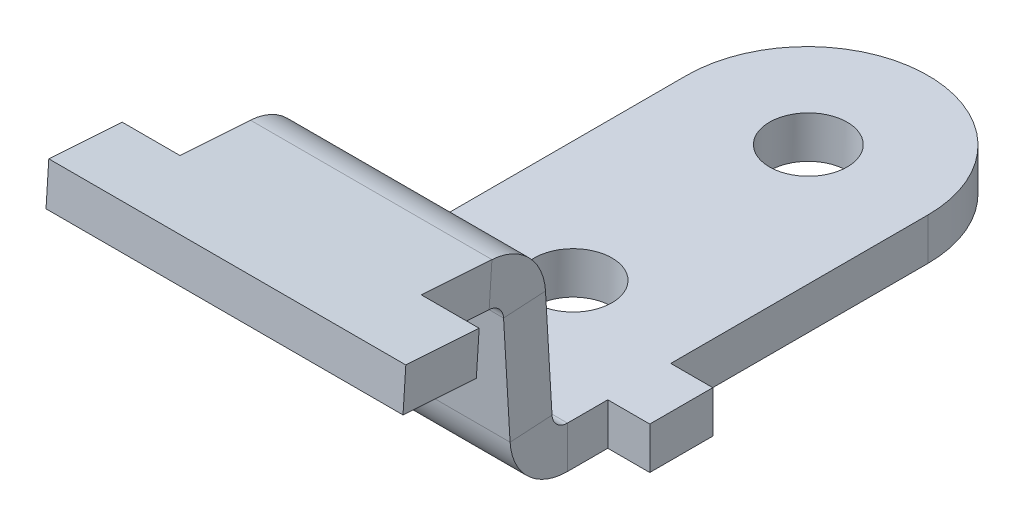
ISO-10303-21;
HEADER;
FILE_DESCRIPTION(('STEP AP214'),'2;1');
FILE_NAME('part.step','',(''),(''),'','','');
FILE_SCHEMA(('AUTOMOTIVE_DESIGN { 1 0 10303 214 1 1 1 1 }'));
ENDSEC;
DATA;
#1=APPLICATION_CONTEXT('core data for automotive mechanical design processes');
#2=APPLICATION_PROTOCOL_DEFINITION('international standard','automotive_design',2000,#1);
#3=PRODUCT_CONTEXT('',#1,'mechanical');
#4=PRODUCT('Part','Part','',(#3));
#5=PRODUCT_RELATED_PRODUCT_CATEGORY('part','',(#4));
#6=PRODUCT_DEFINITION_FORMATION('','',#4);
#7=PRODUCT_DEFINITION_CONTEXT('part definition',#1,'design');
#8=PRODUCT_DEFINITION('design','',#6,#7);
#9=PRODUCT_DEFINITION_SHAPE('','',#8);
#10=(LENGTH_UNIT() NAMED_UNIT(*) SI_UNIT(.MILLI.,.METRE.));
#11=(NAMED_UNIT(*) PLANE_ANGLE_UNIT() SI_UNIT($,.RADIAN.));
#12=(NAMED_UNIT(*) SI_UNIT($,.STERADIAN.) SOLID_ANGLE_UNIT());
#13=UNCERTAINTY_MEASURE_WITH_UNIT(LENGTH_MEASURE(1.E-05),#10,'distance_accuracy_value','');
#14=(GEOMETRIC_REPRESENTATION_CONTEXT(3) GLOBAL_UNCERTAINTY_ASSIGNED_CONTEXT((#13)) GLOBAL_UNIT_ASSIGNED_CONTEXT((#10,
#11,#12)) REPRESENTATION_CONTEXT('',''));
#15=CARTESIAN_POINT('',(0.,0.,0.));
#16=DIRECTION('',(0.,0.,1.));
#17=DIRECTION('',(1.,0.,0.));
#18=AXIS2_PLACEMENT_3D('',#15,#16,#17);
#19=CARTESIAN_POINT('',(5.75,7.8082437090074,26.6971817474205));
#20=DIRECTION('',(-1.,0.,0.));
#21=DIRECTION('',(0.,0.,1.));
#22=AXIS2_PLACEMENT_3D('',#19,#20,#21);
#23=PLANE('',#22);
#24=DIRECTION('',(0.,0.,1.));
#25=VECTOR('',#24,1.);
#26=CARTESIAN_POINT('',(5.75,0.,0.));
#27=LINE('',#26,#25);
#28=CARTESIAN_POINT('',(5.75,0.,5.75));
#29=VERTEX_POINT('',#28);
#30=CARTESIAN_POINT('',(5.75,0.,18.));
#31=VERTEX_POINT('',#30);
#32=EDGE_CURVE('E370',#29,#31,#27,.T.);
#33=ORIENTED_EDGE('',*,*,#32,.F.);
#34=DIRECTION('',(0.,-1.,0.));
#35=VECTOR('',#34,1.);
#36=CARTESIAN_POINT('',(5.75,2.,5.75));
#37=LINE('',#36,#35);
#38=CARTESIAN_POINT('',(5.75,2.,5.75));
#39=VERTEX_POINT('',#38);
#40=EDGE_CURVE('E44',#29,#39,#37,.F.);
#41=ORIENTED_EDGE('',*,*,#40,.T.);
#42=DIRECTION('',(0.,0.,1.));
#43=VECTOR('',#42,1.);
#44=CARTESIAN_POINT('',(5.75,2.,0.));
#45=LINE('',#44,#43);
#46=CARTESIAN_POINT('',(5.75,2.,18.));
#47=VERTEX_POINT('',#46);
#48=EDGE_CURVE('E373',#39,#47,#45,.T.);
#49=ORIENTED_EDGE('',*,*,#48,.T.);
#50=DIRECTION('',(0.,1.,0.));
#51=VECTOR('',#50,1.);
#52=CARTESIAN_POINT('',(5.75,0.,18.));
#53=LINE('',#52,#51);
#54=EDGE_CURVE('E345',#31,#47,#53,.T.);
#55=ORIENTED_EDGE('',*,*,#54,.F.);
#56=EDGE_LOOP('',(#33,#41,#49,#55));
#57=FACE_BOUND('',#56,.T.);
#58=ADVANCED_FACE('F36',(#57),#23,.F.);
#59=CARTESIAN_POINT('',(5.75,2.5759013147276,25.6515236067487));
#60=DIRECTION('',(1.,0.,0.));
#61=DIRECTION('',(0.,0.,-1.));
#62=AXIS2_PLACEMENT_3D('',#59,#60,#61);
#63=PLANE('',#62);
#64=DIRECTION('',(0.,0.0587220219514705,-0.998274373174996));
#65=VECTOR('',#64,1.);
#66=CARTESIAN_POINT('',(5.75,2.5759013147276,25.6515236067487));
#67=LINE('',#66,#65);
#68=CARTESIAN_POINT('',(5.75,2.5759013147276,25.6515236067487));
#69=VERTEX_POINT('',#68);
#70=CARTESIAN_POINT('',(5.75,2.69334535863054,23.6549748603987));
#71=VERTEX_POINT('',#70);
#72=EDGE_CURVE('E407',#69,#71,#67,.T.);
#73=ORIENTED_EDGE('',*,*,#72,.F.);
#74=CARTESIAN_POINT('',(5.75,2.7366,22.919645957118));
#75=DIRECTION('',(1.,0.,0.));
#76=DIRECTION('',(0.,0.,-1.));
#77=AXIS2_PLACEMENT_3D('',#74,#75,#76);
#78=CIRCLE('',#77,2.7366);
#79=CARTESIAN_POINT('',(5.75,0.,22.919645957118));
#80=VERTEX_POINT('',#79);
#81=EDGE_CURVE('E366',#80,#69,#78,.F.);
#82=ORIENTED_EDGE('',*,*,#81,.F.);
#83=DIRECTION('',(0.,-1.,0.));
#84=VECTOR('',#83,1.);
#85=CARTESIAN_POINT('',(5.75,2.,22.919645957118));
#86=LINE('',#85,#84);
#87=CARTESIAN_POINT('',(5.75,2.,22.919645957118));
#88=VERTEX_POINT('',#87);
#89=EDGE_CURVE('E404',#88,#80,#86,.T.);
#90=ORIENTED_EDGE('',*,*,#89,.F.);
#91=CARTESIAN_POINT('',(5.75,2.7366,22.919645957118));
#92=DIRECTION('',(1.,0.,0.));
#93=DIRECTION('',(0.,0.,-1.));
#94=AXIS2_PLACEMENT_3D('',#91,#92,#93);
#95=CIRCLE('',#94,0.7366);
#96=EDGE_CURVE('E375',#88,#71,#95,.F.);
#97=ORIENTED_EDGE('',*,*,#96,.T.);
#98=EDGE_LOOP('',(#73,#82,#90,#97));
#99=FACE_BOUND('',#98,.T.);
#100=ADVANCED_FACE('F420',(#99),#63,.T.);
#101=CARTESIAN_POINT('',(5.75,2.,22.919645957118));
#102=DIRECTION('',(1.,0.,0.));
#103=DIRECTION('',(0.,0.,-1.));
#104=AXIS2_PLACEMENT_3D('',#101,#102,#103);
#105=PLANE('',#104);
#106=DIRECTION('',(0.,0.998274373174996,0.0587220219514708));
#107=VECTOR('',#106,1.);
#108=CARTESIAN_POINT('',(5.75,0.,25.5));
#109=LINE('',#108,#107);
#110=CARTESIAN_POINT('',(5.75,7.85149835037685,25.9618528441398));
#111=VERTEX_POINT('',#110);
#112=EDGE_CURVE('E363',#69,#111,#109,.T.);
#113=ORIENTED_EDGE('',*,*,#112,.F.);
#114=ORIENTED_EDGE('',*,*,#72,.T.);
#115=DIRECTION('',(0.,0.998274373174996,0.0587220219514708));
#116=VECTOR('',#115,1.);
#117=CARTESIAN_POINT('',(5.75,0.117444043902938,23.50345125365));
#118=LINE('',#117,#116);
#119=CARTESIAN_POINT('',(5.75,7.96894239427979,23.9653040977898));
#120=VERTEX_POINT('',#119);
#121=EDGE_CURVE('E378',#71,#120,#118,.T.);
#122=ORIENTED_EDGE('',*,*,#121,.T.);
#123=DIRECTION('',(0.,-0.058722021951469,0.998274373174996));
#124=VECTOR('',#123,1.);
#125=CARTESIAN_POINT('',(5.75,7.96894239427979,23.9653040977898));
#126=LINE('',#125,#124);
#127=EDGE_CURVE('E400',#120,#111,#126,.T.);
#128=ORIENTED_EDGE('',*,*,#127,.T.);
#129=EDGE_LOOP('',(#113,#114,#122,#128));
#130=FACE_BOUND('',#129,.T.);
#131=ADVANCED_FACE('F411',(#130),#105,.T.);
#132=CARTESIAN_POINT('',(5.75,8.54321225628458,26.6481838442687));
#133=DIRECTION('',(1.,0.,0.));
#134=DIRECTION('',(0.,0.,-1.));
#135=AXIS2_PLACEMENT_3D('',#132,#133,#134);
#136=PLANE('',#135);
#137=DIRECTION('',(0.,0.997785157856609,-0.0665190105237738));
#138=VECTOR('',#137,1.);
#139=CARTESIAN_POINT('',(5.75,8.54321225628458,26.6481838442687));
#140=LINE('',#139,#138);
#141=CARTESIAN_POINT('',(5.75,8.54321225628458,26.6481838442687));
#142=VERTEX_POINT('',#141);
#143=CARTESIAN_POINT('',(5.75,10.5387825719978,26.5151458232212));
#144=VERTEX_POINT('',#143);
#145=EDGE_CURVE('E402',#142,#144,#140,.T.);
#146=ORIENTED_EDGE('',*,*,#145,.F.);
#147=CARTESIAN_POINT('',(5.75,7.8082437090074,26.6971817474205));
#148=DIRECTION('',(-1.,0.,0.));
#149=DIRECTION('',(0.,0.,1.));
#150=AXIS2_PLACEMENT_3D('',#147,#148,#149);
#151=CIRCLE('',#150,0.7366);
#152=EDGE_CURVE('E360',#111,#142,#151,.F.);
#153=ORIENTED_EDGE('',*,*,#152,.F.);
#154=ORIENTED_EDGE('',*,*,#127,.F.);
#155=CARTESIAN_POINT('',(5.75,7.8082437090074,26.6971817474205));
#156=DIRECTION('',(1.,0.,0.));
#157=DIRECTION('',(0.,0.,-1.));
#158=AXIS2_PLACEMENT_3D('',#155,#156,#157);
#159=CIRCLE('',#158,2.7366);
#160=EDGE_CURVE('E381',#120,#144,#159,.T.);
#161=ORIENTED_EDGE('',*,*,#160,.T.);
#162=EDGE_LOOP('',(#146,#153,#154,#161));
#163=FACE_BOUND('',#162,.T.);
#164=ADVANCED_FACE('F436',(#163),#136,.T.);
#165=CARTESIAN_POINT('',(5.75,7.96894239427979,23.9653040977898));
#166=DIRECTION('',(1.,0.,0.));
#167=DIRECTION('',(0.,0.,-1.));
#168=AXIS2_PLACEMENT_3D('',#165,#166,#167);
#169=PLANE('',#168);
#170=DIRECTION('',(0.,0.997785157856609,-0.0665190105237738));
#171=VECTOR('',#170,1.);
#172=CARTESIAN_POINT('',(5.75,8.76718346316679,30.0077519475019));
#173=LINE('',#172,#171);
#174=CARTESIAN_POINT('',(5.75,8.76718346316679,30.0077519475019));
#175=VERTEX_POINT('',#174);
#176=CARTESIAN_POINT('',(5.75,10.76275377888,29.8747139264543));
#177=VERTEX_POINT('',#176);
#178=EDGE_CURVE('E321',#175,#177,#173,.T.);
#179=ORIENTED_EDGE('',*,*,#178,.F.);
#180=DIRECTION('',(0.,0.0665190105237738,0.997785157856609));
#181=VECTOR('',#180,1.);
#182=CARTESIAN_POINT('',(5.75,8.5,26.));
#183=LINE('',#182,#181);
#184=EDGE_CURVE('E357',#142,#175,#183,.T.);
#185=ORIENTED_EDGE('',*,*,#184,.F.);
#186=ORIENTED_EDGE('',*,*,#145,.T.);
#187=DIRECTION('',(0.,0.0665190105237738,0.997785157856609));
#188=VECTOR('',#187,1.);
#189=CARTESIAN_POINT('',(5.75,10.4955703157132,25.8669619789525));
#190=LINE('',#189,#188);
#191=EDGE_CURVE('E348',#144,#177,#190,.T.);
#192=ORIENTED_EDGE('',*,*,#191,.T.);
#193=EDGE_LOOP('',(#179,#185,#186,#192));
#194=FACE_BOUND('',#193,.T.);
#195=ADVANCED_FACE('F540',(#194),#169,.T.);
#196=CARTESIAN_POINT('',(5.75,10.4955703157132,25.8669619789525));
#197=DIRECTION('',(0.,-0.997785157856609,0.0665190105237738));
#198=DIRECTION('',(0.,-0.0665190105237738,-0.997785157856609));
#199=AXIS2_PLACEMENT_3D('',#196,#197,#198);
#200=PLANE('',#199);
#201=DIRECTION('',(-1.,0.,0.));
#202=VECTOR('',#201,1.);
#203=CARTESIAN_POINT('',(5.75,10.5387825719978,26.5151458232212));
#204=LINE('',#203,#202);
#205=CARTESIAN_POINT('',(-5.75,10.5387825719978,26.5151458232212));
#206=VERTEX_POINT('',#205);
#207=EDGE_CURVE('E384',#144,#206,#204,.T.);
#208=ORIENTED_EDGE('',*,*,#207,.T.);
#209=DIRECTION('',(0.,0.0665190105237738,0.997785157856609));
#210=VECTOR('',#209,1.);
#211=CARTESIAN_POINT('',(-5.75,10.4955703157132,25.8669619789525));
#212=LINE('',#211,#210);
#213=CARTESIAN_POINT('',(-5.75,10.76275377888,29.8747139264543));
#214=VERTEX_POINT('',#213);
#215=EDGE_CURVE('E247',#206,#214,#212,.T.);
#216=ORIENTED_EDGE('',*,*,#215,.T.);
#217=DIRECTION('',(1.,0.,0.));
#218=VECTOR('',#217,1.);
#219=CARTESIAN_POINT('',(-5.75,10.76275377888,29.8747139264543));
#220=LINE('',#219,#218);
#221=CARTESIAN_POINT('',(-8.5,10.76275377888,29.8747139264543));
#222=VERTEX_POINT('',#221);
#223=EDGE_CURVE('E218',#222,#214,#220,.T.);
#224=ORIENTED_EDGE('',*,*,#223,.F.);
#225=DIRECTION('',(0.,-0.0665190105237738,-0.997785157856609));
#226=VECTOR('',#225,1.);
#227=CARTESIAN_POINT('',(-8.5,10.9955703157132,33.3669619789525));
#228=LINE('',#227,#226);
#229=CARTESIAN_POINT('',(-8.5,10.9955703157132,33.3669619789525));
#230=VERTEX_POINT('',#229);
#231=EDGE_CURVE('E773',#230,#222,#228,.T.);
#232=ORIENTED_EDGE('',*,*,#231,.F.);
#233=DIRECTION('',(-1.,0.,0.));
#234=VECTOR('',#233,1.);
#235=CARTESIAN_POINT('',(5.75,10.9955703157132,33.3669619789525));
#236=LINE('',#235,#234);
#237=CARTESIAN_POINT('',(8.5,10.9955703157132,33.3669619789525));
#238=VERTEX_POINT('',#237);
#239=EDGE_CURVE('E206',#238,#230,#236,.T.);
#240=ORIENTED_EDGE('',*,*,#239,.F.);
#241=DIRECTION('',(0.,-0.0665190105237738,-0.997785157856609));
#242=VECTOR('',#241,1.);
#243=CARTESIAN_POINT('',(8.5,10.9955703157132,33.3669619789525));
#244=LINE('',#243,#242);
#245=CARTESIAN_POINT('',(8.5,10.76275377888,29.8747139264543));
#246=VERTEX_POINT('',#245);
#247=EDGE_CURVE('E311',#238,#246,#244,.T.);
#248=ORIENTED_EDGE('',*,*,#247,.T.);
#249=DIRECTION('',(-1.,0.,0.));
#250=VECTOR('',#249,1.);
#251=CARTESIAN_POINT('',(5.75,10.76275377888,29.8747139264543));
#252=LINE('',#251,#250);
#253=EDGE_CURVE('E314',#246,#177,#252,.T.);
#254=ORIENTED_EDGE('',*,*,#253,.T.);
#255=ORIENTED_EDGE('',*,*,#191,.F.);
#256=EDGE_LOOP('',(#208,#216,#224,#232,#240,#248,#254,#255));
#257=FACE_BOUND('',#256,.T.);
#258=ADVANCED_FACE('F537',(#257),#200,.F.);
#259=CARTESIAN_POINT('',(5.75,9.,33.5));
#260=DIRECTION('',(0.,0.0665190105237738,0.997785157856609));
#261=DIRECTION('',(0.,-0.997785157856609,0.0665190105237738));
#262=AXIS2_PLACEMENT_3D('',#259,#260,#261);
#263=PLANE('',#262);
#264=ORIENTED_EDGE('',*,*,#239,.T.);
#265=DIRECTION('',(0.,0.997785157856609,-0.0665190105237738));
#266=VECTOR('',#265,1.);
#267=CARTESIAN_POINT('',(-8.5,9.,33.5));
#268=LINE('',#267,#266);
#269=CARTESIAN_POINT('',(-8.5,9.,33.5));
#270=VERTEX_POINT('',#269);
#271=EDGE_CURVE('E213',#270,#230,#268,.T.);
#272=ORIENTED_EDGE('',*,*,#271,.F.);
#273=DIRECTION('',(-1.,0.,0.));
#274=VECTOR('',#273,1.);
#275=CARTESIAN_POINT('',(5.75,9.,33.5));
#276=LINE('',#275,#274);
#277=CARTESIAN_POINT('',(8.5,9.,33.5));
#278=VERTEX_POINT('',#277);
#279=EDGE_CURVE('E195',#278,#270,#276,.T.);
#280=ORIENTED_EDGE('',*,*,#279,.F.);
#281=DIRECTION('',(0.,0.997785157856609,-0.0665190105237738));
#282=VECTOR('',#281,1.);
#283=CARTESIAN_POINT('',(8.5,9.,33.5));
#284=LINE('',#283,#282);
#285=EDGE_CURVE('E316',#278,#238,#284,.T.);
#286=ORIENTED_EDGE('',*,*,#285,.T.);
#287=EDGE_LOOP('',(#264,#272,#280,#286));
#288=FACE_BOUND('',#287,.T.);
#289=ADVANCED_FACE('F220',(#288),#263,.T.);
#290=CARTESIAN_POINT('',(5.75,8.5,26.));
#291=DIRECTION('',(0.,-0.997785157856609,0.0665190105237738));
#292=DIRECTION('',(0.,-0.0665190105237738,-0.997785157856609));
#293=AXIS2_PLACEMENT_3D('',#290,#291,#292);
#294=PLANE('',#293);
#295=ORIENTED_EDGE('',*,*,#279,.T.);
#296=DIRECTION('',(0.,-0.0665190105237738,-0.997785157856609));
#297=VECTOR('',#296,1.);
#298=CARTESIAN_POINT('',(-8.5,9.,33.5));
#299=LINE('',#298,#297);
#300=CARTESIAN_POINT('',(-8.5,8.76718346316679,30.0077519475019));
#301=VERTEX_POINT('',#300);
#302=EDGE_CURVE('E198',#270,#301,#299,.T.);
#303=ORIENTED_EDGE('',*,*,#302,.T.);
#304=DIRECTION('',(1.,0.,0.));
#305=VECTOR('',#304,1.);
#306=CARTESIAN_POINT('',(-5.75,8.76718346316679,30.0077519475019));
#307=LINE('',#306,#305);
#308=CARTESIAN_POINT('',(-5.75,8.76718346316679,30.0077519475019));
#309=VERTEX_POINT('',#308);
#310=EDGE_CURVE('E217',#301,#309,#307,.T.);
#311=ORIENTED_EDGE('',*,*,#310,.T.);
#312=DIRECTION('',(0.,0.0665190105237738,0.997785157856609));
#313=VECTOR('',#312,1.);
#314=CARTESIAN_POINT('',(-5.75,8.5,26.));
#315=LINE('',#314,#313);
#316=CARTESIAN_POINT('',(-5.75,8.54321225628458,26.6481838442687));
#317=VERTEX_POINT('',#316);
#318=EDGE_CURVE('E255',#317,#309,#315,.T.);
#319=ORIENTED_EDGE('',*,*,#318,.F.);
#320=DIRECTION('',(-1.,0.,0.));
#321=VECTOR('',#320,1.);
#322=CARTESIAN_POINT('',(5.75,8.54321225628458,26.6481838442687));
#323=LINE('',#322,#321);
#324=EDGE_CURVE('E207',#142,#317,#323,.T.);
#325=ORIENTED_EDGE('',*,*,#324,.F.);
#326=ORIENTED_EDGE('',*,*,#184,.T.);
#327=DIRECTION('',(-1.,0.,0.));
#328=VECTOR('',#327,1.);
#329=CARTESIAN_POINT('',(5.75,8.76718346316679,30.0077519475019));
#330=LINE('',#329,#328);
#331=CARTESIAN_POINT('',(8.5,8.76718346316679,30.0077519475019));
#332=VERTEX_POINT('',#331);
#333=EDGE_CURVE('E313',#332,#175,#330,.T.);
#334=ORIENTED_EDGE('',*,*,#333,.F.);
#335=DIRECTION('',(0.,-0.0665190105237738,-0.997785157856609));
#336=VECTOR('',#335,1.);
#337=CARTESIAN_POINT('',(8.5,9.,33.5));
#338=LINE('',#337,#336);
#339=EDGE_CURVE('E201',#278,#332,#338,.T.);
#340=ORIENTED_EDGE('',*,*,#339,.F.);
#341=EDGE_LOOP('',(#295,#303,#311,#319,#325,#326,#334,#340));
#342=FACE_BOUND('',#341,.T.);
#343=ADVANCED_FACE('F197',(#342),#294,.T.);
#344=CARTESIAN_POINT('',(5.75,7.8082437090074,26.6971817474205));
#345=DIRECTION('',(-1.,0.,0.));
#346=DIRECTION('',(0.,0.,1.));
#347=AXIS2_PLACEMENT_3D('',#344,#345,#346);
#348=CYLINDRICAL_SURFACE('',#347,0.7366);
#349=ORIENTED_EDGE('',*,*,#324,.T.);
#350=CARTESIAN_POINT('',(-5.75,7.8082437090074,26.6971817474205));
#351=DIRECTION('',(-1.,0.,0.));
#352=DIRECTION('',(0.,0.,1.));
#353=AXIS2_PLACEMENT_3D('',#350,#351,#352);
#354=CIRCLE('',#353,0.7366);
#355=CARTESIAN_POINT('',(-5.75,7.85149835037685,25.9618528441398));
#356=VERTEX_POINT('',#355);
#357=EDGE_CURVE('E258',#356,#317,#354,.F.);
#358=ORIENTED_EDGE('',*,*,#357,.F.);
#359=DIRECTION('',(-1.,0.,0.));
#360=VECTOR('',#359,1.);
#361=CARTESIAN_POINT('',(5.75,7.85149835037685,25.9618528441398));
#362=LINE('',#361,#360);
#363=EDGE_CURVE('E396',#111,#356,#362,.T.);
#364=ORIENTED_EDGE('',*,*,#363,.F.);
#365=ORIENTED_EDGE('',*,*,#152,.T.);
#366=EDGE_LOOP('',(#349,#358,#364,#365));
#367=FACE_BOUND('',#366,.T.);
#368=ADVANCED_FACE('F442',(#367),#348,.F.);
#369=CARTESIAN_POINT('',(5.75,0.,25.5));
#370=DIRECTION('',(0.,-0.0587220219514708,0.998274373174996));
#371=DIRECTION('',(0.,-0.998274373174996,-0.0587220219514708));
#372=AXIS2_PLACEMENT_3D('',#369,#370,#371);
#373=PLANE('',#372);
#374=ORIENTED_EDGE('',*,*,#363,.T.);
#375=DIRECTION('',(0.,0.998274373174996,0.0587220219514708));
#376=VECTOR('',#375,1.);
#377=CARTESIAN_POINT('',(-5.75,0.,25.5));
#378=LINE('',#377,#376);
#379=CARTESIAN_POINT('',(-5.75,2.5759013147276,25.6515236067487));
#380=VERTEX_POINT('',#379);
#381=EDGE_CURVE('E261',#380,#356,#378,.T.);
#382=ORIENTED_EDGE('',*,*,#381,.F.);
#383=DIRECTION('',(-1.,0.,0.));
#384=VECTOR('',#383,1.);
#385=CARTESIAN_POINT('',(5.75,2.5759013147276,25.6515236067487));
#386=LINE('',#385,#384);
#387=EDGE_CURVE('E394',#69,#380,#386,.T.);
#388=ORIENTED_EDGE('',*,*,#387,.F.);
#389=ORIENTED_EDGE('',*,*,#112,.T.);
#390=EDGE_LOOP('',(#374,#382,#388,#389));
#391=FACE_BOUND('',#390,.T.);
#392=ADVANCED_FACE('F445',(#391),#373,.T.);
#393=CARTESIAN_POINT('',(5.75,2.7366,22.919645957118));
#394=DIRECTION('',(-1.,0.,0.));
#395=DIRECTION('',(0.,0.,1.));
#396=AXIS2_PLACEMENT_3D('',#393,#394,#395);
#397=CYLINDRICAL_SURFACE('',#396,2.7366);
#398=ORIENTED_EDGE('',*,*,#387,.T.);
#399=CARTESIAN_POINT('',(-5.75,2.7366,22.919645957118));
#400=DIRECTION('',(1.,0.,0.));
#401=DIRECTION('',(0.,0.,-1.));
#402=AXIS2_PLACEMENT_3D('',#399,#400,#401);
#403=CIRCLE('',#402,2.7366);
#404=CARTESIAN_POINT('',(-5.75,0.,22.919645957118));
#405=VERTEX_POINT('',#404);
#406=EDGE_CURVE('E264',#405,#380,#403,.F.);
#407=ORIENTED_EDGE('',*,*,#406,.F.);
#408=DIRECTION('',(-1.,0.,0.));
#409=VECTOR('',#408,1.);
#410=CARTESIAN_POINT('',(5.75,0.,22.919645957118));
#411=LINE('',#410,#409);
#412=EDGE_CURVE('E392',#80,#405,#411,.T.);
#413=ORIENTED_EDGE('',*,*,#412,.F.);
#414=ORIENTED_EDGE('',*,*,#81,.T.);
#415=EDGE_LOOP('',(#398,#407,#413,#414));
#416=FACE_BOUND('',#415,.T.);
#417=ADVANCED_FACE('F448',(#416),#397,.T.);
#418=CARTESIAN_POINT('',(5.75,0.,0.));
#419=DIRECTION('',(0.,-1.,0.));
#420=DIRECTION('',(0.,0.,-1.));
#421=AXIS2_PLACEMENT_3D('',#418,#419,#420);
#422=PLANE('',#421);
#423=ORIENTED_EDGE('',*,*,#412,.T.);
#424=DIRECTION('',(0.,0.,1.));
#425=VECTOR('',#424,1.);
#426=CARTESIAN_POINT('',(-5.75,0.,0.));
#427=LINE('',#426,#425);
#428=CARTESIAN_POINT('',(-5.75,0.,21.));
#429=VERTEX_POINT('',#428);
#430=EDGE_CURVE('E267',#429,#405,#427,.T.);
#431=ORIENTED_EDGE('',*,*,#430,.F.);
#432=DIRECTION('',(-1.,0.,0.));
#433=VECTOR('',#432,1.);
#434=CARTESIAN_POINT('',(-5.75,0.,21.));
#435=LINE('',#434,#433);
#436=CARTESIAN_POINT('',(-7.75,0.,21.));
#437=VERTEX_POINT('',#436);
#438=EDGE_CURVE('E227',#429,#437,#435,.T.);
#439=ORIENTED_EDGE('',*,*,#438,.T.);
#440=DIRECTION('',(0.,0.,-1.));
#441=VECTOR('',#440,1.);
#442=CARTESIAN_POINT('',(-7.75,0.,18.));
#443=LINE('',#442,#441);
#444=CARTESIAN_POINT('',(-7.75,0.,18.));
#445=VERTEX_POINT('',#444);
#446=EDGE_CURVE('E230',#437,#445,#443,.T.);
#447=ORIENTED_EDGE('',*,*,#446,.T.);
#448=DIRECTION('',(1.,0.,0.));
#449=VECTOR('',#448,1.);
#450=CARTESIAN_POINT('',(-5.75,0.,18.));
#451=LINE('',#450,#449);
#452=CARTESIAN_POINT('',(-5.75,0.,18.));
#453=VERTEX_POINT('',#452);
#454=EDGE_CURVE('E234',#445,#453,#451,.T.);
#455=ORIENTED_EDGE('',*,*,#454,.T.);
#456=CARTESIAN_POINT('',(-5.75,0.,5.75));
#457=VERTEX_POINT('',#456);
#458=EDGE_CURVE('E268',#457,#453,#427,.T.);
#459=ORIENTED_EDGE('',*,*,#458,.F.);
#460=CARTESIAN_POINT('',(0.,0.,5.75));
#461=DIRECTION('',(0.,-1.,0.));
#462=DIRECTION('',(0.,0.,-1.));
#463=AXIS2_PLACEMENT_3D('',#460,#461,#462);
#464=CIRCLE('',#463,5.75);
#465=EDGE_CURVE('E58',#457,#29,#464,.T.);
#466=ORIENTED_EDGE('',*,*,#465,.T.);
#467=ORIENTED_EDGE('',*,*,#32,.T.);
#468=DIRECTION('',(-1.,0.,0.));
#469=VECTOR('',#468,1.);
#470=CARTESIAN_POINT('',(5.75,0.,18.));
#471=LINE('',#470,#469);
#472=CARTESIAN_POINT('',(7.75,0.,18.));
#473=VERTEX_POINT('',#472);
#474=EDGE_CURVE('E334',#473,#31,#471,.T.);
#475=ORIENTED_EDGE('',*,*,#474,.F.);
#476=DIRECTION('',(0.,0.,-1.));
#477=VECTOR('',#476,1.);
#478=CARTESIAN_POINT('',(7.75,0.,18.));
#479=LINE('',#478,#477);
#480=CARTESIAN_POINT('',(7.75,0.,21.));
#481=VERTEX_POINT('',#480);
#482=EDGE_CURVE('E330',#481,#473,#479,.T.);
#483=ORIENTED_EDGE('',*,*,#482,.F.);
#484=DIRECTION('',(1.,0.,0.));
#485=VECTOR('',#484,1.);
#486=CARTESIAN_POINT('',(5.75,0.,21.));
#487=LINE('',#486,#485);
#488=CARTESIAN_POINT('',(5.75,0.,21.));
#489=VERTEX_POINT('',#488);
#490=EDGE_CURVE('E327',#489,#481,#487,.T.);
#491=ORIENTED_EDGE('',*,*,#490,.F.);
#492=EDGE_CURVE('E369',#489,#80,#27,.T.);
#493=ORIENTED_EDGE('',*,*,#492,.T.);
#494=EDGE_LOOP('',(#423,#431,#439,#447,#455,#459,#466,#467,#475,#483,#491,#493));
#495=FACE_BOUND('',#494,.T.);
#496=CARTESIAN_POINT('',(0.,0.,16.9));
#497=DIRECTION('',(0.,-1.,0.));
#498=DIRECTION('',(0.,0.,-1.));
#499=AXIS2_PLACEMENT_3D('',#496,#497,#498);
#500=CIRCLE('',#499,1.85);
#501=CARTESIAN_POINT('',(0.,0.,15.05));
#502=VERTEX_POINT('',#501);
#503=EDGE_CURVE('E302',#502,#502,#500,.T.);
#504=ORIENTED_EDGE('',*,*,#503,.F.);
#505=EDGE_LOOP('',(#504));
#506=FACE_BOUND('',#505,.T.);
#507=CARTESIAN_POINT('',(0.,0.,5.7));
#508=DIRECTION('',(0.,-1.,0.));
#509=DIRECTION('',(0.,0.,-1.));
#510=AXIS2_PLACEMENT_3D('',#507,#508,#509);
#511=CIRCLE('',#510,1.85);
#512=CARTESIAN_POINT('',(0.,0.,3.85));
#513=VERTEX_POINT('',#512);
#514=EDGE_CURVE('E308',#513,#513,#511,.T.);
#515=ORIENTED_EDGE('',*,*,#514,.F.);
#516=EDGE_LOOP('',(#515));
#517=FACE_BOUND('',#516,.T.);
#518=ADVANCED_FACE('F452',(#495,#506,#517),#422,.T.);
#519=CARTESIAN_POINT('',(5.75,2.,0.));
#520=DIRECTION('',(0.,-1.,0.));
#521=DIRECTION('',(0.,0.,-1.));
#522=AXIS2_PLACEMENT_3D('',#519,#520,#521);
#523=PLANE('',#522);
#524=DIRECTION('',(0.,0.,1.));
#525=VECTOR('',#524,1.);
#526=CARTESIAN_POINT('',(-5.75,2.,0.));
#527=LINE('',#526,#525);
#528=CARTESIAN_POINT('',(-5.75,2.,21.));
#529=VERTEX_POINT('',#528);
#530=CARTESIAN_POINT('',(-5.75,2.,22.919645957118));
#531=VERTEX_POINT('',#530);
#532=EDGE_CURVE('E271',#529,#531,#527,.T.);
#533=ORIENTED_EDGE('',*,*,#532,.T.);
#534=DIRECTION('',(-1.,0.,0.));
#535=VECTOR('',#534,1.);
#536=CARTESIAN_POINT('',(5.75,2.,22.919645957118));
#537=LINE('',#536,#535);
#538=EDGE_CURVE('E390',#88,#531,#537,.T.);
#539=ORIENTED_EDGE('',*,*,#538,.F.);
#540=CARTESIAN_POINT('',(5.75,2.,21.));
#541=VERTEX_POINT('',#540);
#542=EDGE_CURVE('E372',#541,#88,#45,.T.);
#543=ORIENTED_EDGE('',*,*,#542,.F.);
#544=DIRECTION('',(1.,0.,0.));
#545=VECTOR('',#544,1.);
#546=CARTESIAN_POINT('',(5.75,2.,21.));
#547=LINE('',#546,#545);
#548=CARTESIAN_POINT('',(7.75,2.,21.));
#549=VERTEX_POINT('',#548);
#550=EDGE_CURVE('E323',#541,#549,#547,.T.);
#551=ORIENTED_EDGE('',*,*,#550,.T.);
#552=DIRECTION('',(0.,0.,-1.));
#553=VECTOR('',#552,1.);
#554=CARTESIAN_POINT('',(7.75,2.,18.));
#555=LINE('',#554,#553);
#556=CARTESIAN_POINT('',(7.75,2.,18.));
#557=VERTEX_POINT('',#556);
#558=EDGE_CURVE('E340',#549,#557,#555,.T.);
#559=ORIENTED_EDGE('',*,*,#558,.T.);
#560=DIRECTION('',(-1.,0.,0.));
#561=VECTOR('',#560,1.);
#562=CARTESIAN_POINT('',(5.75,2.,18.));
#563=LINE('',#562,#561);
#564=EDGE_CURVE('E331',#557,#47,#563,.T.);
#565=ORIENTED_EDGE('',*,*,#564,.T.);
#566=ORIENTED_EDGE('',*,*,#48,.F.);
#567=CARTESIAN_POINT('',(0.,2.,5.75));
#568=DIRECTION('',(0.,-1.,0.));
#569=DIRECTION('',(0.,0.,-1.));
#570=AXIS2_PLACEMENT_3D('',#567,#568,#569);
#571=CIRCLE('',#570,5.75);
#572=CARTESIAN_POINT('',(-5.75,2.,5.75));
#573=VERTEX_POINT('',#572);
#574=EDGE_CURVE('E11',#39,#573,#571,.F.);
#575=ORIENTED_EDGE('',*,*,#574,.T.);
#576=CARTESIAN_POINT('',(-5.75,2.,18.));
#577=VERTEX_POINT('',#576);
#578=EDGE_CURVE('E272',#573,#577,#527,.T.);
#579=ORIENTED_EDGE('',*,*,#578,.T.);
#580=DIRECTION('',(1.,0.,0.));
#581=VECTOR('',#580,1.);
#582=CARTESIAN_POINT('',(-5.75,2.,18.));
#583=LINE('',#582,#581);
#584=CARTESIAN_POINT('',(-7.75,2.,18.));
#585=VERTEX_POINT('',#584);
#586=EDGE_CURVE('E231',#585,#577,#583,.T.);
#587=ORIENTED_EDGE('',*,*,#586,.F.);
#588=DIRECTION('',(0.,0.,-1.));
#589=VECTOR('',#588,1.);
#590=CARTESIAN_POINT('',(-7.75,2.,18.));
#591=LINE('',#590,#589);
#592=CARTESIAN_POINT('',(-7.75,2.,21.));
#593=VERTEX_POINT('',#592);
#594=EDGE_CURVE('E240',#593,#585,#591,.T.);
#595=ORIENTED_EDGE('',*,*,#594,.F.);
#596=DIRECTION('',(-1.,0.,0.));
#597=VECTOR('',#596,1.);
#598=CARTESIAN_POINT('',(-5.75,2.,21.));
#599=LINE('',#598,#597);
#600=EDGE_CURVE('E237',#529,#593,#599,.T.);
#601=ORIENTED_EDGE('',*,*,#600,.F.);
#602=EDGE_LOOP('',(#533,#539,#543,#551,#559,#565,#566,#575,#579,#587,#595,#601));
#603=FACE_BOUND('',#602,.T.);
#604=CARTESIAN_POINT('',(0.,2.,16.9));
#605=DIRECTION('',(0.,1.,0.));
#606=DIRECTION('',(0.,0.,1.));
#607=AXIS2_PLACEMENT_3D('',#604,#605,#606);
#608=CIRCLE('',#607,1.85);
#609=CARTESIAN_POINT('',(0.,2.,18.75));
#610=VERTEX_POINT('',#609);
#611=EDGE_CURVE('E299',#610,#610,#608,.T.);
#612=ORIENTED_EDGE('',*,*,#611,.F.);
#613=EDGE_LOOP('',(#612));
#614=FACE_BOUND('',#613,.T.);
#615=CARTESIAN_POINT('',(0.,2.,5.7));
#616=DIRECTION('',(0.,1.,0.));
#617=DIRECTION('',(0.,0.,1.));
#618=AXIS2_PLACEMENT_3D('',#615,#616,#617);
#619=CIRCLE('',#618,1.85);
#620=CARTESIAN_POINT('',(0.,2.,7.55));
#621=VERTEX_POINT('',#620);
#622=EDGE_CURVE('E305',#621,#621,#619,.T.);
#623=ORIENTED_EDGE('',*,*,#622,.F.);
#624=EDGE_LOOP('',(#623));
#625=FACE_BOUND('',#624,.T.);
#626=ADVANCED_FACE('F480',(#603,#614,#625),#523,.F.);
#627=CARTESIAN_POINT('',(5.75,2.7366,22.919645957118));
#628=DIRECTION('',(-1.,0.,0.));
#629=DIRECTION('',(0.,0.,1.));
#630=AXIS2_PLACEMENT_3D('',#627,#628,#629);
#631=CYLINDRICAL_SURFACE('',#630,0.7366);
#632=ORIENTED_EDGE('',*,*,#538,.T.);
#633=CARTESIAN_POINT('',(-5.75,2.7366,22.919645957118));
#634=DIRECTION('',(1.,0.,0.));
#635=DIRECTION('',(0.,0.,-1.));
#636=AXIS2_PLACEMENT_3D('',#633,#634,#635);
#637=CIRCLE('',#636,0.7366);
#638=CARTESIAN_POINT('',(-5.75,2.69334535863054,23.6549748603987));
#639=VERTEX_POINT('',#638);
#640=EDGE_CURVE('E275',#531,#639,#637,.F.);
#641=ORIENTED_EDGE('',*,*,#640,.T.);
#642=DIRECTION('',(-1.,0.,0.));
#643=VECTOR('',#642,1.);
#644=CARTESIAN_POINT('',(5.75,2.69334535863054,23.6549748603987));
#645=LINE('',#644,#643);
#646=EDGE_CURVE('E388',#71,#639,#645,.T.);
#647=ORIENTED_EDGE('',*,*,#646,.F.);
#648=ORIENTED_EDGE('',*,*,#96,.F.);
#649=EDGE_LOOP('',(#632,#641,#647,#648));
#650=FACE_BOUND('',#649,.T.);
#651=ADVANCED_FACE('F423',(#650),#631,.F.);
#652=CARTESIAN_POINT('',(5.75,0.117444043902938,23.50345125365));
#653=DIRECTION('',(0.,-0.0587220219514708,0.998274373174996));
#654=DIRECTION('',(0.,-0.998274373174996,-0.0587220219514708));
#655=AXIS2_PLACEMENT_3D('',#652,#653,#654);
#656=PLANE('',#655);
#657=ORIENTED_EDGE('',*,*,#646,.T.);
#658=DIRECTION('',(0.,0.998274373174996,0.0587220219514708));
#659=VECTOR('',#658,1.);
#660=CARTESIAN_POINT('',(-5.75,0.117444043902938,23.50345125365));
#661=LINE('',#660,#659);
#662=CARTESIAN_POINT('',(-5.75,7.96894239427979,23.9653040977898));
#663=VERTEX_POINT('',#662);
#664=EDGE_CURVE('E278',#639,#663,#661,.T.);
#665=ORIENTED_EDGE('',*,*,#664,.T.);
#666=DIRECTION('',(-1.,0.,0.));
#667=VECTOR('',#666,1.);
#668=CARTESIAN_POINT('',(5.75,7.96894239427979,23.9653040977898));
#669=LINE('',#668,#667);
#670=EDGE_CURVE('E386',#120,#663,#669,.T.);
#671=ORIENTED_EDGE('',*,*,#670,.F.);
#672=ORIENTED_EDGE('',*,*,#121,.F.);
#673=EDGE_LOOP('',(#657,#665,#671,#672));
#674=FACE_BOUND('',#673,.T.);
#675=ADVANCED_FACE('F427',(#674),#656,.F.);
#676=CARTESIAN_POINT('',(5.75,7.8082437090074,26.6971817474205));
#677=DIRECTION('',(-1.,0.,0.));
#678=DIRECTION('',(0.,0.,1.));
#679=AXIS2_PLACEMENT_3D('',#676,#677,#678);
#680=CYLINDRICAL_SURFACE('',#679,2.7366);
#681=ORIENTED_EDGE('',*,*,#670,.T.);
#682=CARTESIAN_POINT('',(-5.75,7.8082437090074,26.6971817474205));
#683=DIRECTION('',(1.,0.,0.));
#684=DIRECTION('',(0.,0.,-1.));
#685=AXIS2_PLACEMENT_3D('',#682,#683,#684);
#686=CIRCLE('',#685,2.7366);
#687=EDGE_CURVE('E281',#663,#206,#686,.T.);
#688=ORIENTED_EDGE('',*,*,#687,.T.);
#689=ORIENTED_EDGE('',*,*,#207,.F.);
#690=ORIENTED_EDGE('',*,*,#160,.F.);
#691=EDGE_LOOP('',(#681,#688,#689,#690));
#692=FACE_BOUND('',#691,.T.);
#693=ADVANCED_FACE('F433',(#692),#680,.T.);
#694=ORIENTED_EDGE('',*,*,#492,.F.);
#695=DIRECTION('',(0.,1.,0.));
#696=VECTOR('',#695,1.);
#697=CARTESIAN_POINT('',(5.75,0.,21.));
#698=LINE('',#697,#696);
#699=EDGE_CURVE('E337',#489,#541,#698,.T.);
#700=ORIENTED_EDGE('',*,*,#699,.T.);
#701=ORIENTED_EDGE('',*,*,#542,.T.);
#702=ORIENTED_EDGE('',*,*,#89,.T.);
#703=EDGE_LOOP('',(#694,#700,#701,#702));
#704=FACE_BOUND('',#703,.T.);
#705=ADVANCED_FACE('F495',(#704),#23,.F.);
#706=CARTESIAN_POINT('',(5.75,0.,18.));
#707=DIRECTION('',(0.,0.,-1.));
#708=DIRECTION('',(0.,1.,0.));
#709=AXIS2_PLACEMENT_3D('',#706,#707,#708);
#710=PLANE('',#709);
#711=ORIENTED_EDGE('',*,*,#564,.F.);
#712=DIRECTION('',(0.,1.,0.));
#713=VECTOR('',#712,1.);
#714=CARTESIAN_POINT('',(7.75,0.,18.));
#715=LINE('',#714,#713);
#716=EDGE_CURVE('E349',#473,#557,#715,.T.);
#717=ORIENTED_EDGE('',*,*,#716,.F.);
#718=ORIENTED_EDGE('',*,*,#474,.T.);
#719=ORIENTED_EDGE('',*,*,#54,.T.);
#720=EDGE_LOOP('',(#711,#717,#718,#719));
#721=FACE_BOUND('',#720,.T.);
#722=ADVANCED_FACE('F485',(#721),#710,.T.);
#723=CARTESIAN_POINT('',(7.75,0.,18.));
#724=DIRECTION('',(1.,0.,0.));
#725=DIRECTION('',(0.,0.,-1.));
#726=AXIS2_PLACEMENT_3D('',#723,#724,#725);
#727=PLANE('',#726);
#728=ORIENTED_EDGE('',*,*,#558,.F.);
#729=DIRECTION('',(0.,1.,0.));
#730=VECTOR('',#729,1.);
#731=CARTESIAN_POINT('',(7.75,0.,21.));
#732=LINE('',#731,#730);
#733=EDGE_CURVE('E351',#481,#549,#732,.T.);
#734=ORIENTED_EDGE('',*,*,#733,.F.);
#735=ORIENTED_EDGE('',*,*,#482,.T.);
#736=ORIENTED_EDGE('',*,*,#716,.T.);
#737=EDGE_LOOP('',(#728,#734,#735,#736));
#738=FACE_BOUND('',#737,.T.);
#739=ADVANCED_FACE('F496',(#738),#727,.T.);
#740=CARTESIAN_POINT('',(5.75,0.,21.));
#741=DIRECTION('',(0.,0.,1.));
#742=DIRECTION('',(0.,-1.,0.));
#743=AXIS2_PLACEMENT_3D('',#740,#741,#742);
#744=PLANE('',#743);
#745=ORIENTED_EDGE('',*,*,#550,.F.);
#746=ORIENTED_EDGE('',*,*,#699,.F.);
#747=ORIENTED_EDGE('',*,*,#490,.T.);
#748=ORIENTED_EDGE('',*,*,#733,.T.);
#749=EDGE_LOOP('',(#745,#746,#747,#748));
#750=FACE_BOUND('',#749,.T.);
#751=ADVANCED_FACE('F492',(#750),#744,.T.);
#752=CARTESIAN_POINT('',(5.75,8.76718346316679,30.0077519475019));
#753=DIRECTION('',(0.,-0.0665190105237738,-0.997785157856609));
#754=DIRECTION('',(0.,0.997785157856609,-0.0665190105237738));
#755=AXIS2_PLACEMENT_3D('',#752,#753,#754);
#756=PLANE('',#755);
#757=ORIENTED_EDGE('',*,*,#253,.F.);
#758=DIRECTION('',(0.,0.997785157856609,-0.0665190105237738));
#759=VECTOR('',#758,1.);
#760=CARTESIAN_POINT('',(8.5,8.76718346316679,30.0077519475019));
#761=LINE('',#760,#759);
#762=EDGE_CURVE('E324',#332,#246,#761,.T.);
#763=ORIENTED_EDGE('',*,*,#762,.F.);
#764=ORIENTED_EDGE('',*,*,#333,.T.);
#765=ORIENTED_EDGE('',*,*,#178,.T.);
#766=EDGE_LOOP('',(#757,#763,#764,#765));
#767=FACE_BOUND('',#766,.T.);
#768=ADVANCED_FACE('F503',(#767),#756,.T.);
#769=CARTESIAN_POINT('',(8.5,9.,33.5));
#770=DIRECTION('',(1.,0.,0.));
#771=DIRECTION('',(0.,0.,-1.));
#772=AXIS2_PLACEMENT_3D('',#769,#770,#771);
#773=PLANE('',#772);
#774=ORIENTED_EDGE('',*,*,#247,.F.);
#775=ORIENTED_EDGE('',*,*,#285,.F.);
#776=ORIENTED_EDGE('',*,*,#339,.T.);
#777=ORIENTED_EDGE('',*,*,#762,.T.);
#778=EDGE_LOOP('',(#774,#775,#776,#777));
#779=FACE_BOUND('',#778,.T.);
#780=ADVANCED_FACE('F620',(#779),#773,.T.);
#781=CARTESIAN_POINT('',(0.,-8.,5.7));
#782=DIRECTION('',(0.,1.,0.));
#783=DIRECTION('',(0.,0.,1.));
#784=AXIS2_PLACEMENT_3D('',#781,#782,#783);
#785=CYLINDRICAL_SURFACE('',#784,1.85);
#786=ORIENTED_EDGE('',*,*,#622,.T.);
#787=EDGE_LOOP('',(#786));
#788=FACE_BOUND('',#787,.T.);
#789=ORIENTED_EDGE('',*,*,#514,.T.);
#790=EDGE_LOOP('',(#789));
#791=FACE_BOUND('',#790,.T.);
#792=ADVANCED_FACE('F615',(#788,#791),#785,.F.);
#793=CARTESIAN_POINT('',(0.,-8.,16.9));
#794=DIRECTION('',(0.,1.,0.));
#795=DIRECTION('',(0.,0.,1.));
#796=AXIS2_PLACEMENT_3D('',#793,#794,#795);
#797=CYLINDRICAL_SURFACE('',#796,1.85);
#798=ORIENTED_EDGE('',*,*,#611,.T.);
#799=EDGE_LOOP('',(#798));
#800=FACE_BOUND('',#799,.T.);
#801=ORIENTED_EDGE('',*,*,#503,.T.);
#802=EDGE_LOOP('',(#801));
#803=FACE_BOUND('',#802,.T.);
#804=ADVANCED_FACE('F619',(#800,#803),#797,.F.);
#805=CARTESIAN_POINT('',(0.,2.,5.75));
#806=DIRECTION('',(0.,1.,0.));
#807=DIRECTION('',(0.,0.,1.));
#808=AXIS2_PLACEMENT_3D('',#805,#806,#807);
#809=CYLINDRICAL_SURFACE('',#808,5.75);
#810=ORIENTED_EDGE('',*,*,#574,.F.);
#811=ORIENTED_EDGE('',*,*,#40,.F.);
#812=ORIENTED_EDGE('',*,*,#465,.F.);
#813=DIRECTION('',(0.,-1.,0.));
#814=VECTOR('',#813,1.);
#815=CARTESIAN_POINT('',(-5.75,2.,5.75));
#816=LINE('',#815,#814);
#817=EDGE_CURVE('E296',#457,#573,#816,.F.);
#818=ORIENTED_EDGE('',*,*,#817,.T.);
#819=EDGE_LOOP('',(#810,#811,#812,#818));
#820=FACE_BOUND('',#819,.T.);
#821=ADVANCED_FACE('F38',(#820),#809,.T.);
#822=CARTESIAN_POINT('',(-5.75,7.8082437090074,26.6971817474205));
#823=DIRECTION('',(1.,0.,0.));
#824=DIRECTION('',(0.,0.,1.));
#825=AXIS2_PLACEMENT_3D('',#822,#823,#824);
#826=PLANE('',#825);
#827=ORIENTED_EDGE('',*,*,#458,.T.);
#828=DIRECTION('',(0.,1.,0.));
#829=VECTOR('',#828,1.);
#830=CARTESIAN_POINT('',(-5.75,0.,18.));
#831=LINE('',#830,#829);
#832=EDGE_CURVE('E244',#453,#577,#831,.T.);
#833=ORIENTED_EDGE('',*,*,#832,.T.);
#834=ORIENTED_EDGE('',*,*,#578,.F.);
#835=ORIENTED_EDGE('',*,*,#817,.F.);
#836=EDGE_LOOP('',(#827,#833,#834,#835));
#837=FACE_BOUND('',#836,.T.);
#838=ADVANCED_FACE('F476',(#837),#826,.F.);
#839=CARTESIAN_POINT('',(-5.75,2.5759013147276,25.6515236067487));
#840=DIRECTION('',(-1.,0.,0.));
#841=DIRECTION('',(0.,0.,-1.));
#842=AXIS2_PLACEMENT_3D('',#839,#840,#841);
#843=PLANE('',#842);
#844=DIRECTION('',(0.,0.0587220219514705,-0.998274373174996));
#845=VECTOR('',#844,1.);
#846=CARTESIAN_POINT('',(-5.75,2.5759013147276,25.6515236067487));
#847=LINE('',#846,#845);
#848=EDGE_CURVE('E293',#380,#639,#847,.T.);
#849=ORIENTED_EDGE('',*,*,#848,.T.);
#850=ORIENTED_EDGE('',*,*,#640,.F.);
#851=DIRECTION('',(0.,-1.,0.));
#852=VECTOR('',#851,1.);
#853=CARTESIAN_POINT('',(-5.75,2.,22.919645957118));
#854=LINE('',#853,#852);
#855=EDGE_CURVE('E290',#531,#405,#854,.T.);
#856=ORIENTED_EDGE('',*,*,#855,.T.);
#857=ORIENTED_EDGE('',*,*,#406,.T.);
#858=EDGE_LOOP('',(#849,#850,#856,#857));
#859=FACE_BOUND('',#858,.T.);
#860=ADVANCED_FACE('F649',(#859),#843,.T.);
#861=CARTESIAN_POINT('',(-5.75,2.,22.919645957118));
#862=DIRECTION('',(-1.,0.,0.));
#863=DIRECTION('',(0.,0.,-1.));
#864=AXIS2_PLACEMENT_3D('',#861,#862,#863);
#865=PLANE('',#864);
#866=ORIENTED_EDGE('',*,*,#381,.T.);
#867=DIRECTION('',(0.,-0.058722021951469,0.998274373174996));
#868=VECTOR('',#867,1.);
#869=CARTESIAN_POINT('',(-5.75,7.96894239427979,23.9653040977898));
#870=LINE('',#869,#868);
#871=EDGE_CURVE('E284',#663,#356,#870,.T.);
#872=ORIENTED_EDGE('',*,*,#871,.F.);
#873=ORIENTED_EDGE('',*,*,#664,.F.);
#874=ORIENTED_EDGE('',*,*,#848,.F.);
#875=EDGE_LOOP('',(#866,#872,#873,#874));
#876=FACE_BOUND('',#875,.T.);
#877=ADVANCED_FACE('F660',(#876),#865,.T.);
#878=CARTESIAN_POINT('',(-5.75,8.54321225628458,26.6481838442687));
#879=DIRECTION('',(-1.,0.,0.));
#880=DIRECTION('',(0.,0.,-1.));
#881=AXIS2_PLACEMENT_3D('',#878,#879,#880);
#882=PLANE('',#881);
#883=DIRECTION('',(0.,0.997785157856609,-0.0665190105237738));
#884=VECTOR('',#883,1.);
#885=CARTESIAN_POINT('',(-5.75,8.54321225628458,26.6481838442687));
#886=LINE('',#885,#884);
#887=EDGE_CURVE('E287',#317,#206,#886,.T.);
#888=ORIENTED_EDGE('',*,*,#887,.T.);
#889=ORIENTED_EDGE('',*,*,#687,.F.);
#890=ORIENTED_EDGE('',*,*,#871,.T.);
#891=ORIENTED_EDGE('',*,*,#357,.T.);
#892=EDGE_LOOP('',(#888,#889,#890,#891));
#893=FACE_BOUND('',#892,.T.);
#894=ADVANCED_FACE('F670',(#893),#882,.T.);
#895=CARTESIAN_POINT('',(-5.75,7.96894239427979,23.9653040977898));
#896=DIRECTION('',(-1.,0.,0.));
#897=DIRECTION('',(0.,0.,-1.));
#898=AXIS2_PLACEMENT_3D('',#895,#896,#897);
#899=PLANE('',#898);
#900=DIRECTION('',(0.,0.997785157856609,-0.0665190105237738));
#901=VECTOR('',#900,1.);
#902=CARTESIAN_POINT('',(-5.75,8.76718346316679,30.0077519475019));
#903=LINE('',#902,#901);
#904=EDGE_CURVE('E222',#309,#214,#903,.T.);
#905=ORIENTED_EDGE('',*,*,#904,.T.);
#906=ORIENTED_EDGE('',*,*,#215,.F.);
#907=ORIENTED_EDGE('',*,*,#887,.F.);
#908=ORIENTED_EDGE('',*,*,#318,.T.);
#909=EDGE_LOOP('',(#905,#906,#907,#908));
#910=FACE_BOUND('',#909,.T.);
#911=ADVANCED_FACE('F681',(#910),#899,.T.);
#912=ORIENTED_EDGE('',*,*,#430,.T.);
#913=ORIENTED_EDGE('',*,*,#855,.F.);
#914=ORIENTED_EDGE('',*,*,#532,.F.);
#915=DIRECTION('',(0.,1.,0.));
#916=VECTOR('',#915,1.);
#917=CARTESIAN_POINT('',(-5.75,0.,21.));
#918=LINE('',#917,#916);
#919=EDGE_CURVE('E236',#429,#529,#918,.T.);
#920=ORIENTED_EDGE('',*,*,#919,.F.);
#921=EDGE_LOOP('',(#912,#913,#914,#920));
#922=FACE_BOUND('',#921,.T.);
#923=ADVANCED_FACE('F457',(#922),#826,.F.);
#924=CARTESIAN_POINT('',(-5.75,0.,18.));
#925=DIRECTION('',(0.,0.,-1.));
#926=DIRECTION('',(0.,1.,0.));
#927=AXIS2_PLACEMENT_3D('',#924,#925,#926);
#928=PLANE('',#927);
#929=ORIENTED_EDGE('',*,*,#586,.T.);
#930=ORIENTED_EDGE('',*,*,#832,.F.);
#931=ORIENTED_EDGE('',*,*,#454,.F.);
#932=DIRECTION('',(0.,1.,0.));
#933=VECTOR('',#932,1.);
#934=CARTESIAN_POINT('',(-7.75,0.,18.));
#935=LINE('',#934,#933);
#936=EDGE_CURVE('E248',#445,#585,#935,.T.);
#937=ORIENTED_EDGE('',*,*,#936,.T.);
#938=EDGE_LOOP('',(#929,#930,#931,#937));
#939=FACE_BOUND('',#938,.T.);
#940=ADVANCED_FACE('F472',(#939),#928,.T.);
#941=CARTESIAN_POINT('',(-7.75,0.,18.));
#942=DIRECTION('',(-1.,0.,0.));
#943=DIRECTION('',(0.,0.,-1.));
#944=AXIS2_PLACEMENT_3D('',#941,#942,#943);
#945=PLANE('',#944);
#946=ORIENTED_EDGE('',*,*,#594,.T.);
#947=ORIENTED_EDGE('',*,*,#936,.F.);
#948=ORIENTED_EDGE('',*,*,#446,.F.);
#949=DIRECTION('',(0.,1.,0.));
#950=VECTOR('',#949,1.);
#951=CARTESIAN_POINT('',(-7.75,0.,21.));
#952=LINE('',#951,#950);
#953=EDGE_CURVE('E250',#437,#593,#952,.T.);
#954=ORIENTED_EDGE('',*,*,#953,.T.);
#955=EDGE_LOOP('',(#946,#947,#948,#954));
#956=FACE_BOUND('',#955,.T.);
#957=ADVANCED_FACE('F468',(#956),#945,.T.);
#958=CARTESIAN_POINT('',(-5.75,0.,21.));
#959=DIRECTION('',(0.,0.,1.));
#960=DIRECTION('',(0.,-1.,0.));
#961=AXIS2_PLACEMENT_3D('',#958,#959,#960);
#962=PLANE('',#961);
#963=ORIENTED_EDGE('',*,*,#600,.T.);
#964=ORIENTED_EDGE('',*,*,#953,.F.);
#965=ORIENTED_EDGE('',*,*,#438,.F.);
#966=ORIENTED_EDGE('',*,*,#919,.T.);
#967=EDGE_LOOP('',(#963,#964,#965,#966));
#968=FACE_BOUND('',#967,.T.);
#969=ADVANCED_FACE('F463',(#968),#962,.T.);
#970=CARTESIAN_POINT('',(-5.75,8.76718346316679,30.0077519475019));
#971=DIRECTION('',(0.,-0.0665190105237738,-0.997785157856609));
#972=DIRECTION('',(0.,0.997785157856609,-0.0665190105237738));
#973=AXIS2_PLACEMENT_3D('',#970,#971,#972);
#974=PLANE('',#973);
#975=ORIENTED_EDGE('',*,*,#223,.T.);
#976=ORIENTED_EDGE('',*,*,#904,.F.);
#977=ORIENTED_EDGE('',*,*,#310,.F.);
#978=DIRECTION('',(0.,0.997785157856609,-0.0665190105237738));
#979=VECTOR('',#978,1.);
#980=CARTESIAN_POINT('',(-8.5,8.76718346316679,30.0077519475019));
#981=LINE('',#980,#979);
#982=EDGE_CURVE('E215',#301,#222,#981,.T.);
#983=ORIENTED_EDGE('',*,*,#982,.T.);
#984=EDGE_LOOP('',(#975,#976,#977,#983));
#985=FACE_BOUND('',#984,.T.);
#986=ADVANCED_FACE('F726',(#985),#974,.T.);
#987=CARTESIAN_POINT('',(-8.5,9.,33.5));
#988=DIRECTION('',(-1.,0.,0.));
#989=DIRECTION('',(0.,0.,-1.));
#990=AXIS2_PLACEMENT_3D('',#987,#988,#989);
#991=PLANE('',#990);
#992=ORIENTED_EDGE('',*,*,#231,.T.);
#993=ORIENTED_EDGE('',*,*,#982,.F.);
#994=ORIENTED_EDGE('',*,*,#302,.F.);
#995=ORIENTED_EDGE('',*,*,#271,.T.);
#996=EDGE_LOOP('',(#992,#993,#994,#995));
#997=FACE_BOUND('',#996,.T.);
#998=ADVANCED_FACE('F212',(#997),#991,.T.);
#999=CLOSED_SHELL('',(#58,#100,#131,#164,#195,#258,#289,#343,#368,#392,#417,#518,#626,#651,#675,
#693,#705,#722,#739,#751,#768,#780,#792,#804,#821,#838,#860,#877,#894,#911,#923,#940,#957,#969,
#986,#998));
#1000=MANIFOLD_SOLID_BREP('B2',#999);
#1001=ADVANCED_BREP_SHAPE_REPRESENTATION('',(#18,#1000),#14);
#1002=SHAPE_DEFINITION_REPRESENTATION(#9,#1001);
ENDSEC;
END-ISO-10303-21;
